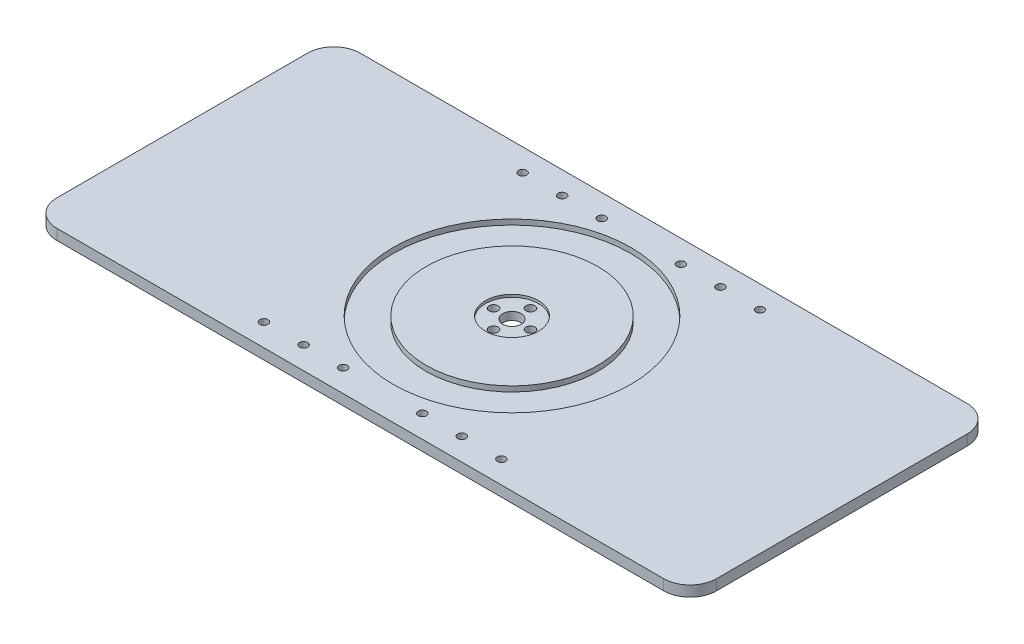
ISO-10303-21;
HEADER;
FILE_DESCRIPTION(('STEP AP214'),'2;1');
FILE_NAME('part.step','',(''),(''),'','','');
FILE_SCHEMA(('AUTOMOTIVE_DESIGN { 1 0 10303 214 1 1 1 1 }'));
ENDSEC;
DATA;
#1=APPLICATION_CONTEXT('core data for automotive mechanical design processes');
#2=APPLICATION_PROTOCOL_DEFINITION('international standard','automotive_design',2000,#1);
#3=PRODUCT_CONTEXT('',#1,'mechanical');
#4=PRODUCT('Part','Part','',(#3));
#5=PRODUCT_RELATED_PRODUCT_CATEGORY('part','',(#4));
#6=PRODUCT_DEFINITION_FORMATION('','',#4);
#7=PRODUCT_DEFINITION_CONTEXT('part definition',#1,'design');
#8=PRODUCT_DEFINITION('design','',#6,#7);
#9=PRODUCT_DEFINITION_SHAPE('','',#8);
#10=(LENGTH_UNIT() NAMED_UNIT(*) SI_UNIT(.MILLI.,.METRE.));
#11=(NAMED_UNIT(*) PLANE_ANGLE_UNIT() SI_UNIT($,.RADIAN.));
#12=(NAMED_UNIT(*) SI_UNIT($,.STERADIAN.) SOLID_ANGLE_UNIT());
#13=UNCERTAINTY_MEASURE_WITH_UNIT(LENGTH_MEASURE(1.E-05),#10,'distance_accuracy_value','');
#14=(GEOMETRIC_REPRESENTATION_CONTEXT(3) GLOBAL_UNCERTAINTY_ASSIGNED_CONTEXT((#13)) GLOBAL_UNIT_ASSIGNED_CONTEXT((#10,
#11,#12)) REPRESENTATION_CONTEXT('',''));
#15=CARTESIAN_POINT('',(0.,0.,0.));
#16=DIRECTION('',(0.,0.,1.));
#17=DIRECTION('',(1.,0.,0.));
#18=AXIS2_PLACEMENT_3D('',#15,#16,#17);
#19=CARTESIAN_POINT('',(0.,4.,0.));
#20=DIRECTION('',(0.,-1.,0.));
#21=DIRECTION('',(0.,0.,-1.));
#22=AXIS2_PLACEMENT_3D('',#19,#20,#21);
#23=CYLINDRICAL_SURFACE('',#22,3.5);
#24=CARTESIAN_POINT('',(0.,0.,0.));
#25=DIRECTION('',(0.,1.,0.));
#26=DIRECTION('',(0.,0.,1.));
#27=AXIS2_PLACEMENT_3D('',#24,#25,#26);
#28=CIRCLE('',#27,3.5);
#29=CARTESIAN_POINT('',(0.,0.,3.5));
#30=VERTEX_POINT('',#29);
#31=EDGE_CURVE('E133',#30,#30,#28,.T.);
#32=ORIENTED_EDGE('',*,*,#31,.F.);
#33=EDGE_LOOP('',(#32));
#34=FACE_BOUND('',#33,.T.);
#35=CARTESIAN_POINT('',(0.,3.,0.));
#36=DIRECTION('',(0.,1.,0.));
#37=DIRECTION('',(0.,0.,1.));
#38=AXIS2_PLACEMENT_3D('',#35,#36,#37);
#39=CIRCLE('',#38,3.5);
#40=CARTESIAN_POINT('',(0.,3.,3.5));
#41=VERTEX_POINT('',#40);
#42=EDGE_CURVE('E148',#41,#41,#39,.T.);
#43=ORIENTED_EDGE('',*,*,#42,.T.);
#44=EDGE_LOOP('',(#43));
#45=FACE_BOUND('',#44,.T.);
#46=ADVANCED_FACE('F39',(#34,#45),#23,.F.);
#47=CARTESIAN_POINT('',(0.,4.,0.));
#48=DIRECTION('',(0.,-1.,0.));
#49=DIRECTION('',(0.,0.,-1.));
#50=AXIS2_PLACEMENT_3D('',#47,#48,#49);
#51=PLANE('',#50);
#52=CARTESIAN_POINT('',(0.,4.,0.));
#53=DIRECTION('',(0.,1.,0.));
#54=DIRECTION('',(0.,0.,1.));
#55=AXIS2_PLACEMENT_3D('',#52,#53,#54);
#56=CIRCLE('',#55,10.05);
#57=CARTESIAN_POINT('',(0.,4.,10.05));
#58=VERTEX_POINT('',#57);
#59=EDGE_CURVE('E273',#58,#58,#56,.T.);
#60=ORIENTED_EDGE('',*,*,#59,.F.);
#61=EDGE_LOOP('',(#60));
#62=FACE_BOUND('',#61,.T.);
#63=CARTESIAN_POINT('',(0.,4.,0.));
#64=DIRECTION('',(0.,1.,0.));
#65=DIRECTION('',(0.,0.,1.));
#66=AXIS2_PLACEMENT_3D('',#63,#64,#65);
#67=CIRCLE('',#66,32.5);
#68=CARTESIAN_POINT('',(0.,4.,32.5));
#69=VERTEX_POINT('',#68);
#70=EDGE_CURVE('E151',#69,#69,#67,.T.);
#71=ORIENTED_EDGE('',*,*,#70,.T.);
#72=EDGE_LOOP('',(#71));
#73=FACE_BOUND('',#72,.T.);
#74=ADVANCED_FACE('F323',(#62,#73),#51,.F.);
#75=CARTESIAN_POINT('',(0.,4.,0.));
#76=DIRECTION('',(0.,1.,0.));
#77=DIRECTION('',(0.,0.,1.));
#78=AXIS2_PLACEMENT_3D('',#75,#76,#77);
#79=CIRCLE('',#78,45.);
#80=CARTESIAN_POINT('',(0.,4.,45.));
#81=VERTEX_POINT('',#80);
#82=EDGE_CURVE('E263',#81,#81,#79,.T.);
#83=ORIENTED_EDGE('',*,*,#82,.F.);
#84=EDGE_LOOP('',(#83));
#85=FACE_BOUND('',#84,.T.);
#86=DIRECTION('',(1.,0.,0.));
#87=VECTOR('',#86,1.);
#88=CARTESIAN_POINT('',(-125.,4.,57.5));
#89=LINE('',#88,#87);
#90=CARTESIAN_POINT('',(-115.,4.,57.5));
#91=VERTEX_POINT('',#90);
#92=CARTESIAN_POINT('',(115.,4.,57.5));
#93=VERTEX_POINT('',#92);
#94=EDGE_CURVE('E142',#91,#93,#89,.T.);
#95=ORIENTED_EDGE('',*,*,#94,.T.);
#96=CARTESIAN_POINT('',(115.,4.,47.5));
#97=DIRECTION('',(0.,-1.,0.));
#98=DIRECTION('',(0.,0.,-1.));
#99=AXIS2_PLACEMENT_3D('',#96,#97,#98);
#100=CIRCLE('',#99,10.);
#101=CARTESIAN_POINT('',(125.,4.,47.5));
#102=VERTEX_POINT('',#101);
#103=EDGE_CURVE('E166',#93,#102,#100,.F.);
#104=ORIENTED_EDGE('',*,*,#103,.T.);
#105=DIRECTION('',(0.,0.,-1.));
#106=VECTOR('',#105,1.);
#107=CARTESIAN_POINT('',(125.,4.,57.5));
#108=LINE('',#107,#106);
#109=CARTESIAN_POINT('',(125.,4.,-47.5));
#110=VERTEX_POINT('',#109);
#111=EDGE_CURVE('E125',#102,#110,#108,.T.);
#112=ORIENTED_EDGE('',*,*,#111,.T.);
#113=CARTESIAN_POINT('',(115.,4.,-47.5));
#114=DIRECTION('',(0.,-1.,0.));
#115=DIRECTION('',(0.,0.,-1.));
#116=AXIS2_PLACEMENT_3D('',#113,#114,#115);
#117=CIRCLE('',#116,10.);
#118=CARTESIAN_POINT('',(115.,4.,-57.5));
#119=VERTEX_POINT('',#118);
#120=EDGE_CURVE('E164',#110,#119,#117,.F.);
#121=ORIENTED_EDGE('',*,*,#120,.T.);
#122=DIRECTION('',(-1.,0.,0.));
#123=VECTOR('',#122,1.);
#124=CARTESIAN_POINT('',(-125.,4.,-57.5));
#125=LINE('',#124,#123);
#126=CARTESIAN_POINT('',(-115.,4.,-57.5));
#127=VERTEX_POINT('',#126);
#128=EDGE_CURVE('E177',#119,#127,#125,.T.);
#129=ORIENTED_EDGE('',*,*,#128,.T.);
#130=CARTESIAN_POINT('',(-115.,4.,-47.5));
#131=DIRECTION('',(0.,-1.,0.));
#132=DIRECTION('',(0.,0.,-1.));
#133=AXIS2_PLACEMENT_3D('',#130,#131,#132);
#134=CIRCLE('',#133,10.);
#135=CARTESIAN_POINT('',(-125.,4.,-47.5));
#136=VERTEX_POINT('',#135);
#137=EDGE_CURVE('E60',#127,#136,#134,.F.);
#138=ORIENTED_EDGE('',*,*,#137,.T.);
#139=DIRECTION('',(0.,0.,1.));
#140=VECTOR('',#139,1.);
#141=CARTESIAN_POINT('',(-125.,4.,57.5));
#142=LINE('',#141,#140);
#143=CARTESIAN_POINT('',(-125.,4.,47.5));
#144=VERTEX_POINT('',#143);
#145=EDGE_CURVE('E185',#136,#144,#142,.T.);
#146=ORIENTED_EDGE('',*,*,#145,.T.);
#147=CARTESIAN_POINT('',(-115.,4.,47.5));
#148=DIRECTION('',(0.,-1.,0.));
#149=DIRECTION('',(0.,0.,-1.));
#150=AXIS2_PLACEMENT_3D('',#147,#148,#149);
#151=CIRCLE('',#150,10.);
#152=EDGE_CURVE('E161',#144,#91,#151,.F.);
#153=ORIENTED_EDGE('',*,*,#152,.T.);
#154=EDGE_LOOP('',(#95,#104,#112,#121,#129,#138,#146,#153));
#155=FACE_BOUND('',#154,.T.);
#156=CARTESIAN_POINT('',(45.,4.,-49.));
#157=DIRECTION('',(0.,1.,0.));
#158=DIRECTION('',(0.,0.,1.));
#159=AXIS2_PLACEMENT_3D('',#156,#157,#158);
#160=CIRCLE('',#159,1.55);
#161=CARTESIAN_POINT('',(45.,4.,-47.45));
#162=VERTEX_POINT('',#161);
#163=EDGE_CURVE('E139',#162,#162,#160,.T.);
#164=ORIENTED_EDGE('',*,*,#163,.F.);
#165=EDGE_LOOP('',(#164));
#166=FACE_BOUND('',#165,.T.);
#167=CARTESIAN_POINT('',(45.,4.,49.));
#168=DIRECTION('',(0.,1.,0.));
#169=DIRECTION('',(0.,0.,-1.));
#170=AXIS2_PLACEMENT_3D('',#167,#168,#169);
#171=CIRCLE('',#170,1.55);
#172=CARTESIAN_POINT('',(45.,4.,47.45));
#173=VERTEX_POINT('',#172);
#174=EDGE_CURVE('E194',#173,#173,#171,.T.);
#175=ORIENTED_EDGE('',*,*,#174,.F.);
#176=EDGE_LOOP('',(#175));
#177=FACE_BOUND('',#176,.T.);
#178=CARTESIAN_POINT('',(-45.,4.,49.));
#179=DIRECTION('',(0.,1.,0.));
#180=DIRECTION('',(0.,0.,1.));
#181=AXIS2_PLACEMENT_3D('',#178,#179,#180);
#182=CIRCLE('',#181,1.55);
#183=CARTESIAN_POINT('',(-45.,4.,50.55));
#184=VERTEX_POINT('',#183);
#185=EDGE_CURVE('E200',#184,#184,#182,.T.);
#186=ORIENTED_EDGE('',*,*,#185,.F.);
#187=EDGE_LOOP('',(#186));
#188=FACE_BOUND('',#187,.T.);
#189=CARTESIAN_POINT('',(-45.,4.,-49.));
#190=DIRECTION('',(0.,1.,0.));
#191=DIRECTION('',(0.,0.,-1.));
#192=AXIS2_PLACEMENT_3D('',#189,#190,#191);
#193=CIRCLE('',#192,1.55);
#194=CARTESIAN_POINT('',(-45.,4.,-50.55));
#195=VERTEX_POINT('',#194);
#196=EDGE_CURVE('E206',#195,#195,#193,.T.);
#197=ORIENTED_EDGE('',*,*,#196,.F.);
#198=EDGE_LOOP('',(#197));
#199=FACE_BOUND('',#198,.T.);
#200=CARTESIAN_POINT('',(-15.,4.,49.));
#201=DIRECTION('',(0.,1.,0.));
#202=DIRECTION('',(0.,0.,1.));
#203=AXIS2_PLACEMENT_3D('',#200,#201,#202);
#204=CIRCLE('',#203,1.55);
#205=CARTESIAN_POINT('',(-15.,4.,50.55));
#206=VERTEX_POINT('',#205);
#207=EDGE_CURVE('E212',#206,#206,#204,.T.);
#208=ORIENTED_EDGE('',*,*,#207,.F.);
#209=EDGE_LOOP('',(#208));
#210=FACE_BOUND('',#209,.T.);
#211=CARTESIAN_POINT('',(15.,4.,49.));
#212=DIRECTION('',(0.,1.,0.));
#213=DIRECTION('',(0.,0.,-1.));
#214=AXIS2_PLACEMENT_3D('',#211,#212,#213);
#215=CIRCLE('',#214,1.55);
#216=CARTESIAN_POINT('',(15.,4.,47.45));
#217=VERTEX_POINT('',#216);
#218=EDGE_CURVE('E218',#217,#217,#215,.T.);
#219=ORIENTED_EDGE('',*,*,#218,.F.);
#220=EDGE_LOOP('',(#219));
#221=FACE_BOUND('',#220,.T.);
#222=CARTESIAN_POINT('',(15.,4.,-49.));
#223=DIRECTION('',(0.,1.,0.));
#224=DIRECTION('',(0.,0.,1.));
#225=AXIS2_PLACEMENT_3D('',#222,#223,#224);
#226=CIRCLE('',#225,1.55);
#227=CARTESIAN_POINT('',(15.,4.,-47.45));
#228=VERTEX_POINT('',#227);
#229=EDGE_CURVE('E224',#228,#228,#226,.T.);
#230=ORIENTED_EDGE('',*,*,#229,.F.);
#231=EDGE_LOOP('',(#230));
#232=FACE_BOUND('',#231,.T.);
#233=CARTESIAN_POINT('',(-15.,4.,-49.));
#234=DIRECTION('',(0.,1.,0.));
#235=DIRECTION('',(0.,0.,-1.));
#236=AXIS2_PLACEMENT_3D('',#233,#234,#235);
#237=CIRCLE('',#236,1.55);
#238=CARTESIAN_POINT('',(-15.,4.,-50.55));
#239=VERTEX_POINT('',#238);
#240=EDGE_CURVE('E230',#239,#239,#237,.T.);
#241=ORIENTED_EDGE('',*,*,#240,.F.);
#242=EDGE_LOOP('',(#241));
#243=FACE_BOUND('',#242,.T.);
#244=CARTESIAN_POINT('',(30.0000000000001,4.,-49.000000000001));
#245=DIRECTION('',(0.,1.,0.));
#246=DIRECTION('',(0.,0.,1.));
#247=AXIS2_PLACEMENT_3D('',#244,#245,#246);
#248=CIRCLE('',#247,1.55);
#249=CARTESIAN_POINT('',(30.0000000000001,4.,-47.450000000001));
#250=VERTEX_POINT('',#249);
#251=EDGE_CURVE('E236',#250,#250,#248,.T.);
#252=ORIENTED_EDGE('',*,*,#251,.F.);
#253=EDGE_LOOP('',(#252));
#254=FACE_BOUND('',#253,.T.);
#255=CARTESIAN_POINT('',(-29.9999999999999,4.,-49.000000000001));
#256=DIRECTION('',(0.,1.,0.));
#257=DIRECTION('',(0.,0.,1.));
#258=AXIS2_PLACEMENT_3D('',#255,#256,#257);
#259=CIRCLE('',#258,1.55);
#260=CARTESIAN_POINT('',(-29.9999999999999,4.,-47.450000000001));
#261=VERTEX_POINT('',#260);
#262=EDGE_CURVE('E242',#261,#261,#259,.T.);
#263=ORIENTED_EDGE('',*,*,#262,.F.);
#264=EDGE_LOOP('',(#263));
#265=FACE_BOUND('',#264,.T.);
#266=CARTESIAN_POINT('',(-30.,4.,48.999999999999));
#267=DIRECTION('',(0.,1.,0.));
#268=DIRECTION('',(0.,0.,1.));
#269=AXIS2_PLACEMENT_3D('',#266,#267,#268);
#270=CIRCLE('',#269,1.55000000000001);
#271=CARTESIAN_POINT('',(-30.,4.,50.549999999999));
#272=VERTEX_POINT('',#271);
#273=EDGE_CURVE('E248',#272,#272,#270,.T.);
#274=ORIENTED_EDGE('',*,*,#273,.F.);
#275=EDGE_LOOP('',(#274));
#276=FACE_BOUND('',#275,.T.);
#277=CARTESIAN_POINT('',(30.,4.,48.9999999999991));
#278=DIRECTION('',(0.,1.,0.));
#279=DIRECTION('',(0.,0.,1.));
#280=AXIS2_PLACEMENT_3D('',#277,#278,#279);
#281=CIRCLE('',#280,1.55);
#282=CARTESIAN_POINT('',(30.,4.,50.5499999999991));
#283=VERTEX_POINT('',#282);
#284=EDGE_CURVE('E254',#283,#283,#281,.T.);
#285=ORIENTED_EDGE('',*,*,#284,.F.);
#286=EDGE_LOOP('',(#285));
#287=FACE_BOUND('',#286,.T.);
#288=ADVANCED_FACE('F329',(#85,#155,#166,#177,#188,#199,#210,#221,#232,#243,#254,#265,#276,
#287),#51,.F.);
#289=CARTESIAN_POINT('',(0.,0.,0.));
#290=DIRECTION('',(0.,-1.,0.));
#291=DIRECTION('',(0.,0.,-1.));
#292=AXIS2_PLACEMENT_3D('',#289,#290,#291);
#293=PLANE('',#292);
#294=CARTESIAN_POINT('',(7.0000000000002,0.,-1.97666086873723E-13));
#295=DIRECTION('',(0.,-1.,0.));
#296=DIRECTION('',(0.,0.,-1.));
#297=AXIS2_PLACEMENT_3D('',#294,#295,#296);
#298=CIRCLE('',#297,1.70000000000015);
#299=CARTESIAN_POINT('',(7.0000000000002,0.,-1.70000000000035));
#300=VERTEX_POINT('',#299);
#301=EDGE_CURVE('E290',#300,#300,#298,.F.);
#302=ORIENTED_EDGE('',*,*,#301,.T.);
#303=EDGE_LOOP('',(#302));
#304=FACE_BOUND('',#303,.T.);
#305=CARTESIAN_POINT('',(0.,0.,-7.));
#306=DIRECTION('',(0.,-1.,0.));
#307=DIRECTION('',(0.,0.,-1.));
#308=AXIS2_PLACEMENT_3D('',#305,#306,#307);
#309=CIRCLE('',#308,1.7);
#310=CARTESIAN_POINT('',(0.,0.,-8.7));
#311=VERTEX_POINT('',#310);
#312=EDGE_CURVE('E296',#311,#311,#309,.F.);
#313=ORIENTED_EDGE('',*,*,#312,.T.);
#314=EDGE_LOOP('',(#313));
#315=FACE_BOUND('',#314,.T.);
#316=CARTESIAN_POINT('',(3.95332173747447E-13,0.,7.));
#317=DIRECTION('',(0.,-1.,0.));
#318=DIRECTION('',(0.,0.,-1.));
#319=AXIS2_PLACEMENT_3D('',#316,#317,#318);
#320=CIRCLE('',#319,1.70000000000042);
#321=CARTESIAN_POINT('',(3.95332173747447E-13,0.,5.29999999999958));
#322=VERTEX_POINT('',#321);
#323=EDGE_CURVE('E284',#322,#322,#320,.F.);
#324=ORIENTED_EDGE('',*,*,#323,.T.);
#325=EDGE_LOOP('',(#324));
#326=FACE_BOUND('',#325,.T.);
#327=CARTESIAN_POINT('',(-6.9999999999998,0.,1.98523339633126E-13));
#328=DIRECTION('',(0.,-1.,0.));
#329=DIRECTION('',(0.,0.,-1.));
#330=AXIS2_PLACEMENT_3D('',#327,#328,#329);
#331=CIRCLE('',#330,1.70000000000032);
#332=CARTESIAN_POINT('',(-6.9999999999998,0.,-1.70000000000012));
#333=VERTEX_POINT('',#332);
#334=EDGE_CURVE('E276',#333,#333,#331,.F.);
#335=ORIENTED_EDGE('',*,*,#334,.T.);
#336=EDGE_LOOP('',(#335));
#337=FACE_BOUND('',#336,.T.);
#338=CARTESIAN_POINT('',(-30.,0.,48.999999999999));
#339=DIRECTION('',(0.,1.,0.));
#340=DIRECTION('',(0.,0.,1.));
#341=AXIS2_PLACEMENT_3D('',#338,#339,#340);
#342=CIRCLE('',#341,1.55000000000001);
#343=CARTESIAN_POINT('',(-30.,0.,50.549999999999));
#344=VERTEX_POINT('',#343);
#345=EDGE_CURVE('E251',#344,#344,#342,.T.);
#346=ORIENTED_EDGE('',*,*,#345,.T.);
#347=EDGE_LOOP('',(#346));
#348=FACE_BOUND('',#347,.T.);
#349=CARTESIAN_POINT('',(30.0000000000001,0.,-49.000000000001));
#350=DIRECTION('',(0.,1.,0.));
#351=DIRECTION('',(0.,0.,1.));
#352=AXIS2_PLACEMENT_3D('',#349,#350,#351);
#353=CIRCLE('',#352,1.55);
#354=CARTESIAN_POINT('',(30.0000000000001,0.,-47.450000000001));
#355=VERTEX_POINT('',#354);
#356=EDGE_CURVE('E239',#355,#355,#353,.T.);
#357=ORIENTED_EDGE('',*,*,#356,.T.);
#358=EDGE_LOOP('',(#357));
#359=FACE_BOUND('',#358,.T.);
#360=CARTESIAN_POINT('',(15.,0.,-49.));
#361=DIRECTION('',(0.,1.,0.));
#362=DIRECTION('',(0.,0.,1.));
#363=AXIS2_PLACEMENT_3D('',#360,#361,#362);
#364=CIRCLE('',#363,1.55);
#365=CARTESIAN_POINT('',(15.,0.,-47.45));
#366=VERTEX_POINT('',#365);
#367=EDGE_CURVE('E227',#366,#366,#364,.T.);
#368=ORIENTED_EDGE('',*,*,#367,.T.);
#369=EDGE_LOOP('',(#368));
#370=FACE_BOUND('',#369,.T.);
#371=CARTESIAN_POINT('',(-15.,0.,49.));
#372=DIRECTION('',(0.,1.,0.));
#373=DIRECTION('',(0.,0.,1.));
#374=AXIS2_PLACEMENT_3D('',#371,#372,#373);
#375=CIRCLE('',#374,1.55);
#376=CARTESIAN_POINT('',(-15.,0.,50.55));
#377=VERTEX_POINT('',#376);
#378=EDGE_CURVE('E215',#377,#377,#375,.T.);
#379=ORIENTED_EDGE('',*,*,#378,.T.);
#380=EDGE_LOOP('',(#379));
#381=FACE_BOUND('',#380,.T.);
#382=CARTESIAN_POINT('',(-45.,0.,49.));
#383=DIRECTION('',(0.,1.,0.));
#384=DIRECTION('',(0.,0.,1.));
#385=AXIS2_PLACEMENT_3D('',#382,#383,#384);
#386=CIRCLE('',#385,1.55);
#387=CARTESIAN_POINT('',(-45.,0.,50.55));
#388=VERTEX_POINT('',#387);
#389=EDGE_CURVE('E203',#388,#388,#386,.T.);
#390=ORIENTED_EDGE('',*,*,#389,.T.);
#391=EDGE_LOOP('',(#390));
#392=FACE_BOUND('',#391,.T.);
#393=CARTESIAN_POINT('',(45.,0.,-49.));
#394=DIRECTION('',(0.,1.,0.));
#395=DIRECTION('',(0.,0.,1.));
#396=AXIS2_PLACEMENT_3D('',#393,#394,#395);
#397=CIRCLE('',#396,1.55);
#398=CARTESIAN_POINT('',(45.,0.,-47.45));
#399=VERTEX_POINT('',#398);
#400=EDGE_CURVE('E191',#399,#399,#397,.T.);
#401=ORIENTED_EDGE('',*,*,#400,.T.);
#402=EDGE_LOOP('',(#401));
#403=FACE_BOUND('',#402,.T.);
#404=DIRECTION('',(0.,0.,-1.));
#405=VECTOR('',#404,1.);
#406=CARTESIAN_POINT('',(125.,0.,57.5));
#407=LINE('',#406,#405);
#408=CARTESIAN_POINT('',(125.,0.,47.5));
#409=VERTEX_POINT('',#408);
#410=CARTESIAN_POINT('',(125.,0.,-47.5));
#411=VERTEX_POINT('',#410);
#412=EDGE_CURVE('E122',#409,#411,#407,.T.);
#413=ORIENTED_EDGE('',*,*,#412,.F.);
#414=CARTESIAN_POINT('',(115.,0.,47.5));
#415=DIRECTION('',(0.,-1.,0.));
#416=DIRECTION('',(0.,0.,-1.));
#417=AXIS2_PLACEMENT_3D('',#414,#415,#416);
#418=CIRCLE('',#417,10.);
#419=CARTESIAN_POINT('',(115.,0.,57.5));
#420=VERTEX_POINT('',#419);
#421=EDGE_CURVE('E105',#409,#420,#418,.T.);
#422=ORIENTED_EDGE('',*,*,#421,.T.);
#423=DIRECTION('',(1.,0.,0.));
#424=VECTOR('',#423,1.);
#425=CARTESIAN_POINT('',(-125.,0.,57.5));
#426=LINE('',#425,#424);
#427=CARTESIAN_POINT('',(-115.,0.,57.5));
#428=VERTEX_POINT('',#427);
#429=EDGE_CURVE('E146',#428,#420,#426,.T.);
#430=ORIENTED_EDGE('',*,*,#429,.F.);
#431=CARTESIAN_POINT('',(-115.,0.,47.5));
#432=DIRECTION('',(0.,-1.,0.));
#433=DIRECTION('',(0.,0.,-1.));
#434=AXIS2_PLACEMENT_3D('',#431,#432,#433);
#435=CIRCLE('',#434,10.);
#436=CARTESIAN_POINT('',(-125.,0.,47.5));
#437=VERTEX_POINT('',#436);
#438=EDGE_CURVE('E126',#428,#437,#435,.T.);
#439=ORIENTED_EDGE('',*,*,#438,.T.);
#440=DIRECTION('',(0.,0.,1.));
#441=VECTOR('',#440,1.);
#442=CARTESIAN_POINT('',(-125.,0.,57.5));
#443=LINE('',#442,#441);
#444=CARTESIAN_POINT('',(-125.,0.,-47.5));
#445=VERTEX_POINT('',#444);
#446=EDGE_CURVE('E136',#445,#437,#443,.T.);
#447=ORIENTED_EDGE('',*,*,#446,.F.);
#448=CARTESIAN_POINT('',(-115.,0.,-47.5));
#449=DIRECTION('',(0.,-1.,0.));
#450=DIRECTION('',(0.,0.,-1.));
#451=AXIS2_PLACEMENT_3D('',#448,#449,#450);
#452=CIRCLE('',#451,10.);
#453=CARTESIAN_POINT('',(-115.,0.,-57.5));
#454=VERTEX_POINT('',#453);
#455=EDGE_CURVE('E155',#445,#454,#452,.T.);
#456=ORIENTED_EDGE('',*,*,#455,.T.);
#457=DIRECTION('',(-1.,0.,0.));
#458=VECTOR('',#457,1.);
#459=CARTESIAN_POINT('',(-125.,0.,-57.5));
#460=LINE('',#459,#458);
#461=CARTESIAN_POINT('',(115.,0.,-57.5));
#462=VERTEX_POINT('',#461);
#463=EDGE_CURVE('E132',#462,#454,#460,.T.);
#464=ORIENTED_EDGE('',*,*,#463,.F.);
#465=CARTESIAN_POINT('',(115.,0.,-47.5));
#466=DIRECTION('',(0.,-1.,0.));
#467=DIRECTION('',(0.,0.,-1.));
#468=AXIS2_PLACEMENT_3D('',#465,#466,#467);
#469=CIRCLE('',#468,10.);
#470=EDGE_CURVE('E116',#462,#411,#469,.T.);
#471=ORIENTED_EDGE('',*,*,#470,.T.);
#472=EDGE_LOOP('',(#413,#422,#430,#439,#447,#456,#464,#471));
#473=FACE_BOUND('',#472,.T.);
#474=ORIENTED_EDGE('',*,*,#31,.T.);
#475=EDGE_LOOP('',(#474));
#476=FACE_BOUND('',#475,.T.);
#477=CARTESIAN_POINT('',(45.,0.,49.));
#478=DIRECTION('',(0.,1.,0.));
#479=DIRECTION('',(0.,0.,-1.));
#480=AXIS2_PLACEMENT_3D('',#477,#478,#479);
#481=CIRCLE('',#480,1.55);
#482=CARTESIAN_POINT('',(45.,0.,47.45));
#483=VERTEX_POINT('',#482);
#484=EDGE_CURVE('E197',#483,#483,#481,.T.);
#485=ORIENTED_EDGE('',*,*,#484,.T.);
#486=EDGE_LOOP('',(#485));
#487=FACE_BOUND('',#486,.T.);
#488=CARTESIAN_POINT('',(-45.,0.,-49.));
#489=DIRECTION('',(0.,1.,0.));
#490=DIRECTION('',(0.,0.,-1.));
#491=AXIS2_PLACEMENT_3D('',#488,#489,#490);
#492=CIRCLE('',#491,1.55);
#493=CARTESIAN_POINT('',(-45.,0.,-50.55));
#494=VERTEX_POINT('',#493);
#495=EDGE_CURVE('E209',#494,#494,#492,.T.);
#496=ORIENTED_EDGE('',*,*,#495,.T.);
#497=EDGE_LOOP('',(#496));
#498=FACE_BOUND('',#497,.T.);
#499=CARTESIAN_POINT('',(15.,0.,49.));
#500=DIRECTION('',(0.,1.,0.));
#501=DIRECTION('',(0.,0.,-1.));
#502=AXIS2_PLACEMENT_3D('',#499,#500,#501);
#503=CIRCLE('',#502,1.55);
#504=CARTESIAN_POINT('',(15.,0.,47.45));
#505=VERTEX_POINT('',#504);
#506=EDGE_CURVE('E221',#505,#505,#503,.T.);
#507=ORIENTED_EDGE('',*,*,#506,.T.);
#508=EDGE_LOOP('',(#507));
#509=FACE_BOUND('',#508,.T.);
#510=CARTESIAN_POINT('',(-15.,0.,-49.));
#511=DIRECTION('',(0.,1.,0.));
#512=DIRECTION('',(0.,0.,-1.));
#513=AXIS2_PLACEMENT_3D('',#510,#511,#512);
#514=CIRCLE('',#513,1.55);
#515=CARTESIAN_POINT('',(-15.,0.,-50.55));
#516=VERTEX_POINT('',#515);
#517=EDGE_CURVE('E233',#516,#516,#514,.T.);
#518=ORIENTED_EDGE('',*,*,#517,.T.);
#519=EDGE_LOOP('',(#518));
#520=FACE_BOUND('',#519,.T.);
#521=CARTESIAN_POINT('',(-29.9999999999999,0.,-49.000000000001));
#522=DIRECTION('',(0.,1.,0.));
#523=DIRECTION('',(0.,0.,1.));
#524=AXIS2_PLACEMENT_3D('',#521,#522,#523);
#525=CIRCLE('',#524,1.55);
#526=CARTESIAN_POINT('',(-29.9999999999999,0.,-47.450000000001));
#527=VERTEX_POINT('',#526);
#528=EDGE_CURVE('E245',#527,#527,#525,.T.);
#529=ORIENTED_EDGE('',*,*,#528,.T.);
#530=EDGE_LOOP('',(#529));
#531=FACE_BOUND('',#530,.T.);
#532=CARTESIAN_POINT('',(30.,0.,48.9999999999991));
#533=DIRECTION('',(0.,1.,0.));
#534=DIRECTION('',(0.,0.,1.));
#535=AXIS2_PLACEMENT_3D('',#532,#533,#534);
#536=CIRCLE('',#535,1.55);
#537=CARTESIAN_POINT('',(30.,0.,50.5499999999991));
#538=VERTEX_POINT('',#537);
#539=EDGE_CURVE('E257',#538,#538,#536,.T.);
#540=ORIENTED_EDGE('',*,*,#539,.T.);
#541=EDGE_LOOP('',(#540));
#542=FACE_BOUND('',#541,.T.);
#543=ADVANCED_FACE('F129',(#304,#315,#326,#337,#348,#359,#370,#381,#392,#403,#473,#476,#487,
#498,#509,#520,#531,#542),#293,.T.);
#544=CARTESIAN_POINT('',(125.,4.,57.5));
#545=DIRECTION('',(-1.,0.,0.));
#546=DIRECTION('',(0.,0.,1.));
#547=AXIS2_PLACEMENT_3D('',#544,#545,#546);
#548=PLANE('',#547);
#549=ORIENTED_EDGE('',*,*,#111,.F.);
#550=DIRECTION('',(0.,-1.,0.));
#551=VECTOR('',#550,1.);
#552=CARTESIAN_POINT('',(125.,4.,47.5));
#553=LINE('',#552,#551);
#554=EDGE_CURVE('E109',#102,#409,#553,.T.);
#555=ORIENTED_EDGE('',*,*,#554,.T.);
#556=ORIENTED_EDGE('',*,*,#412,.T.);
#557=DIRECTION('',(0.,-1.,0.));
#558=VECTOR('',#557,1.);
#559=CARTESIAN_POINT('',(125.,4.,-47.5));
#560=LINE('',#559,#558);
#561=EDGE_CURVE('E127',#411,#110,#560,.F.);
#562=ORIENTED_EDGE('',*,*,#561,.T.);
#563=EDGE_LOOP('',(#549,#555,#556,#562));
#564=FACE_BOUND('',#563,.T.);
#565=ADVANCED_FACE('F121',(#564),#548,.F.);
#566=CARTESIAN_POINT('',(-125.,4.,-57.5));
#567=DIRECTION('',(0.,0.,1.));
#568=DIRECTION('',(1.,0.,0.));
#569=AXIS2_PLACEMENT_3D('',#566,#567,#568);
#570=PLANE('',#569);
#571=ORIENTED_EDGE('',*,*,#128,.F.);
#572=DIRECTION('',(0.,-1.,0.));
#573=VECTOR('',#572,1.);
#574=CARTESIAN_POINT('',(115.,4.,-57.5));
#575=LINE('',#574,#573);
#576=EDGE_CURVE('E170',#119,#462,#575,.T.);
#577=ORIENTED_EDGE('',*,*,#576,.T.);
#578=ORIENTED_EDGE('',*,*,#463,.T.);
#579=DIRECTION('',(0.,-1.,0.));
#580=VECTOR('',#579,1.);
#581=CARTESIAN_POINT('',(-115.,4.,-57.5));
#582=LINE('',#581,#580);
#583=EDGE_CURVE('E168',#454,#127,#582,.F.);
#584=ORIENTED_EDGE('',*,*,#583,.T.);
#585=EDGE_LOOP('',(#571,#577,#578,#584));
#586=FACE_BOUND('',#585,.T.);
#587=ADVANCED_FACE('F175',(#586),#570,.F.);
#588=CARTESIAN_POINT('',(-125.,4.,57.5));
#589=DIRECTION('',(1.,0.,0.));
#590=DIRECTION('',(0.,0.,-1.));
#591=AXIS2_PLACEMENT_3D('',#588,#589,#590);
#592=PLANE('',#591);
#593=ORIENTED_EDGE('',*,*,#145,.F.);
#594=DIRECTION('',(0.,-1.,0.));
#595=VECTOR('',#594,1.);
#596=CARTESIAN_POINT('',(-125.,4.,-47.5));
#597=LINE('',#596,#595);
#598=EDGE_CURVE('E11',#136,#445,#597,.T.);
#599=ORIENTED_EDGE('',*,*,#598,.T.);
#600=ORIENTED_EDGE('',*,*,#446,.T.);
#601=DIRECTION('',(0.,-1.,0.));
#602=VECTOR('',#601,1.);
#603=CARTESIAN_POINT('',(-125.,4.,47.5));
#604=LINE('',#603,#602);
#605=EDGE_CURVE('E47',#437,#144,#604,.F.);
#606=ORIENTED_EDGE('',*,*,#605,.T.);
#607=EDGE_LOOP('',(#593,#599,#600,#606));
#608=FACE_BOUND('',#607,.T.);
#609=ADVANCED_FACE('F184',(#608),#592,.F.);
#610=CARTESIAN_POINT('',(-125.,4.,57.5));
#611=DIRECTION('',(0.,0.,-1.));
#612=DIRECTION('',(-1.,0.,0.));
#613=AXIS2_PLACEMENT_3D('',#610,#611,#612);
#614=PLANE('',#613);
#615=ORIENTED_EDGE('',*,*,#429,.T.);
#616=DIRECTION('',(0.,-1.,0.));
#617=VECTOR('',#616,1.);
#618=CARTESIAN_POINT('',(115.,4.,57.5));
#619=LINE('',#618,#617);
#620=EDGE_CURVE('E110',#420,#93,#619,.F.);
#621=ORIENTED_EDGE('',*,*,#620,.T.);
#622=ORIENTED_EDGE('',*,*,#94,.F.);
#623=DIRECTION('',(0.,-1.,0.));
#624=VECTOR('',#623,1.);
#625=CARTESIAN_POINT('',(-115.,4.,57.5));
#626=LINE('',#625,#624);
#627=EDGE_CURVE('E115',#91,#428,#626,.T.);
#628=ORIENTED_EDGE('',*,*,#627,.T.);
#629=EDGE_LOOP('',(#615,#621,#622,#628));
#630=FACE_BOUND('',#629,.T.);
#631=ADVANCED_FACE('F343',(#630),#614,.F.);
#632=CARTESIAN_POINT('',(45.,4.,-49.));
#633=DIRECTION('',(0.,-1.,0.));
#634=DIRECTION('',(0.,0.,-1.));
#635=AXIS2_PLACEMENT_3D('',#632,#633,#634);
#636=CYLINDRICAL_SURFACE('',#635,1.55);
#637=ORIENTED_EDGE('',*,*,#163,.T.);
#638=EDGE_LOOP('',(#637));
#639=FACE_BOUND('',#638,.T.);
#640=ORIENTED_EDGE('',*,*,#400,.F.);
#641=EDGE_LOOP('',(#640));
#642=FACE_BOUND('',#641,.T.);
#643=ADVANCED_FACE('F335',(#639,#642),#636,.F.);
#644=CARTESIAN_POINT('',(45.,4.,49.));
#645=DIRECTION('',(0.,-1.,0.));
#646=DIRECTION('',(0.,0.,-1.));
#647=AXIS2_PLACEMENT_3D('',#644,#645,#646);
#648=CYLINDRICAL_SURFACE('',#647,1.55);
#649=ORIENTED_EDGE('',*,*,#174,.T.);
#650=EDGE_LOOP('',(#649));
#651=FACE_BOUND('',#650,.T.);
#652=ORIENTED_EDGE('',*,*,#484,.F.);
#653=EDGE_LOOP('',(#652));
#654=FACE_BOUND('',#653,.T.);
#655=ADVANCED_FACE('F440',(#651,#654),#648,.F.);
#656=CARTESIAN_POINT('',(-45.,4.,49.));
#657=DIRECTION('',(0.,-1.,0.));
#658=DIRECTION('',(0.,0.,-1.));
#659=AXIS2_PLACEMENT_3D('',#656,#657,#658);
#660=CYLINDRICAL_SURFACE('',#659,1.55);
#661=ORIENTED_EDGE('',*,*,#185,.T.);
#662=EDGE_LOOP('',(#661));
#663=FACE_BOUND('',#662,.T.);
#664=ORIENTED_EDGE('',*,*,#389,.F.);
#665=EDGE_LOOP('',(#664));
#666=FACE_BOUND('',#665,.T.);
#667=ADVANCED_FACE('F437',(#663,#666),#660,.F.);
#668=CARTESIAN_POINT('',(-45.,4.,-49.));
#669=DIRECTION('',(0.,-1.,0.));
#670=DIRECTION('',(0.,0.,-1.));
#671=AXIS2_PLACEMENT_3D('',#668,#669,#670);
#672=CYLINDRICAL_SURFACE('',#671,1.55);
#673=ORIENTED_EDGE('',*,*,#196,.T.);
#674=EDGE_LOOP('',(#673));
#675=FACE_BOUND('',#674,.T.);
#676=ORIENTED_EDGE('',*,*,#495,.F.);
#677=EDGE_LOOP('',(#676));
#678=FACE_BOUND('',#677,.T.);
#679=ADVANCED_FACE('F433',(#675,#678),#672,.F.);
#680=CARTESIAN_POINT('',(-15.,4.,49.));
#681=DIRECTION('',(0.,-1.,0.));
#682=DIRECTION('',(0.,0.,-1.));
#683=AXIS2_PLACEMENT_3D('',#680,#681,#682);
#684=CYLINDRICAL_SURFACE('',#683,1.55);
#685=ORIENTED_EDGE('',*,*,#207,.T.);
#686=EDGE_LOOP('',(#685));
#687=FACE_BOUND('',#686,.T.);
#688=ORIENTED_EDGE('',*,*,#378,.F.);
#689=EDGE_LOOP('',(#688));
#690=FACE_BOUND('',#689,.T.);
#691=ADVANCED_FACE('F429',(#687,#690),#684,.F.);
#692=CARTESIAN_POINT('',(15.,4.,49.));
#693=DIRECTION('',(0.,-1.,0.));
#694=DIRECTION('',(0.,0.,-1.));
#695=AXIS2_PLACEMENT_3D('',#692,#693,#694);
#696=CYLINDRICAL_SURFACE('',#695,1.55);
#697=ORIENTED_EDGE('',*,*,#218,.T.);
#698=EDGE_LOOP('',(#697));
#699=FACE_BOUND('',#698,.T.);
#700=ORIENTED_EDGE('',*,*,#506,.F.);
#701=EDGE_LOOP('',(#700));
#702=FACE_BOUND('',#701,.T.);
#703=ADVANCED_FACE('F425',(#699,#702),#696,.F.);
#704=CARTESIAN_POINT('',(15.,4.,-49.));
#705=DIRECTION('',(0.,-1.,0.));
#706=DIRECTION('',(0.,0.,-1.));
#707=AXIS2_PLACEMENT_3D('',#704,#705,#706);
#708=CYLINDRICAL_SURFACE('',#707,1.55);
#709=ORIENTED_EDGE('',*,*,#229,.T.);
#710=EDGE_LOOP('',(#709));
#711=FACE_BOUND('',#710,.T.);
#712=ORIENTED_EDGE('',*,*,#367,.F.);
#713=EDGE_LOOP('',(#712));
#714=FACE_BOUND('',#713,.T.);
#715=ADVANCED_FACE('F421',(#711,#714),#708,.F.);
#716=CARTESIAN_POINT('',(-15.,4.,-49.));
#717=DIRECTION('',(0.,-1.,0.));
#718=DIRECTION('',(0.,0.,-1.));
#719=AXIS2_PLACEMENT_3D('',#716,#717,#718);
#720=CYLINDRICAL_SURFACE('',#719,1.55);
#721=ORIENTED_EDGE('',*,*,#240,.T.);
#722=EDGE_LOOP('',(#721));
#723=FACE_BOUND('',#722,.T.);
#724=ORIENTED_EDGE('',*,*,#517,.F.);
#725=EDGE_LOOP('',(#724));
#726=FACE_BOUND('',#725,.T.);
#727=ADVANCED_FACE('F417',(#723,#726),#720,.F.);
#728=CARTESIAN_POINT('',(30.0000000000001,4.,-49.000000000001));
#729=DIRECTION('',(0.,-1.,0.));
#730=DIRECTION('',(0.,0.,-1.));
#731=AXIS2_PLACEMENT_3D('',#728,#729,#730);
#732=CYLINDRICAL_SURFACE('',#731,1.55);
#733=ORIENTED_EDGE('',*,*,#251,.T.);
#734=EDGE_LOOP('',(#733));
#735=FACE_BOUND('',#734,.T.);
#736=ORIENTED_EDGE('',*,*,#356,.F.);
#737=EDGE_LOOP('',(#736));
#738=FACE_BOUND('',#737,.T.);
#739=ADVANCED_FACE('F413',(#735,#738),#732,.F.);
#740=CARTESIAN_POINT('',(-29.9999999999999,4.,-49.000000000001));
#741=DIRECTION('',(0.,-1.,0.));
#742=DIRECTION('',(0.,0.,-1.));
#743=AXIS2_PLACEMENT_3D('',#740,#741,#742);
#744=CYLINDRICAL_SURFACE('',#743,1.55);
#745=ORIENTED_EDGE('',*,*,#262,.T.);
#746=EDGE_LOOP('',(#745));
#747=FACE_BOUND('',#746,.T.);
#748=ORIENTED_EDGE('',*,*,#528,.F.);
#749=EDGE_LOOP('',(#748));
#750=FACE_BOUND('',#749,.T.);
#751=ADVANCED_FACE('F406',(#747,#750),#744,.F.);
#752=CARTESIAN_POINT('',(-30.,4.,48.999999999999));
#753=DIRECTION('',(0.,-1.,0.));
#754=DIRECTION('',(0.,0.,-1.));
#755=AXIS2_PLACEMENT_3D('',#752,#753,#754);
#756=CYLINDRICAL_SURFACE('',#755,1.55000000000001);
#757=ORIENTED_EDGE('',*,*,#273,.T.);
#758=EDGE_LOOP('',(#757));
#759=FACE_BOUND('',#758,.T.);
#760=ORIENTED_EDGE('',*,*,#345,.F.);
#761=EDGE_LOOP('',(#760));
#762=FACE_BOUND('',#761,.T.);
#763=ADVANCED_FACE('F395',(#759,#762),#756,.F.);
#764=CARTESIAN_POINT('',(30.,4.,48.9999999999991));
#765=DIRECTION('',(0.,-1.,0.));
#766=DIRECTION('',(0.,0.,-1.));
#767=AXIS2_PLACEMENT_3D('',#764,#765,#766);
#768=CYLINDRICAL_SURFACE('',#767,1.55);
#769=ORIENTED_EDGE('',*,*,#284,.T.);
#770=EDGE_LOOP('',(#769));
#771=FACE_BOUND('',#770,.T.);
#772=ORIENTED_EDGE('',*,*,#539,.F.);
#773=EDGE_LOOP('',(#772));
#774=FACE_BOUND('',#773,.T.);
#775=ADVANCED_FACE('F391',(#771,#774),#768,.F.);
#776=CARTESIAN_POINT('',(0.,2.,0.));
#777=DIRECTION('',(0.,1.,0.));
#778=DIRECTION('',(0.,0.,1.));
#779=AXIS2_PLACEMENT_3D('',#776,#777,#778);
#780=CYLINDRICAL_SURFACE('',#779,45.);
#781=CARTESIAN_POINT('',(0.,2.,0.));
#782=DIRECTION('',(0.,1.,0.));
#783=DIRECTION('',(0.,0.,1.));
#784=AXIS2_PLACEMENT_3D('',#781,#782,#783);
#785=CIRCLE('',#784,45.);
#786=CARTESIAN_POINT('',(0.,2.,45.));
#787=VERTEX_POINT('',#786);
#788=EDGE_CURVE('E260',#787,#787,#785,.T.);
#789=ORIENTED_EDGE('',*,*,#788,.F.);
#790=EDGE_LOOP('',(#789));
#791=FACE_BOUND('',#790,.T.);
#792=ORIENTED_EDGE('',*,*,#82,.T.);
#793=EDGE_LOOP('',(#792));
#794=FACE_BOUND('',#793,.T.);
#795=ADVANCED_FACE('F394',(#791,#794),#780,.F.);
#796=CARTESIAN_POINT('',(0.,2.,0.));
#797=DIRECTION('',(0.,1.,0.));
#798=DIRECTION('',(0.,0.,1.));
#799=AXIS2_PLACEMENT_3D('',#796,#797,#798);
#800=PLANE('',#799);
#801=CARTESIAN_POINT('',(0.,2.,0.));
#802=DIRECTION('',(0.,1.,0.));
#803=DIRECTION('',(0.,0.,1.));
#804=AXIS2_PLACEMENT_3D('',#801,#802,#803);
#805=CIRCLE('',#804,32.5);
#806=CARTESIAN_POINT('',(0.,2.,32.5));
#807=VERTEX_POINT('',#806);
#808=EDGE_CURVE('E266',#807,#807,#805,.T.);
#809=ORIENTED_EDGE('',*,*,#808,.F.);
#810=EDGE_LOOP('',(#809));
#811=FACE_BOUND('',#810,.T.);
#812=ORIENTED_EDGE('',*,*,#788,.T.);
#813=EDGE_LOOP('',(#812));
#814=FACE_BOUND('',#813,.T.);
#815=ADVANCED_FACE('F403',(#811,#814),#800,.T.);
#816=CARTESIAN_POINT('',(0.,2.,0.));
#817=DIRECTION('',(0.,1.,0.));
#818=DIRECTION('',(0.,0.,1.));
#819=AXIS2_PLACEMENT_3D('',#816,#817,#818);
#820=CYLINDRICAL_SURFACE('',#819,32.5);
#821=ORIENTED_EDGE('',*,*,#808,.T.);
#822=EDGE_LOOP('',(#821));
#823=FACE_BOUND('',#822,.T.);
#824=ORIENTED_EDGE('',*,*,#70,.F.);
#825=EDGE_LOOP('',(#824));
#826=FACE_BOUND('',#825,.T.);
#827=ADVANCED_FACE('F531',(#823,#826),#820,.T.);
#828=CARTESIAN_POINT('',(0.,3.,0.));
#829=DIRECTION('',(0.,1.,0.));
#830=DIRECTION('',(0.,0.,1.));
#831=AXIS2_PLACEMENT_3D('',#828,#829,#830);
#832=CYLINDRICAL_SURFACE('',#831,10.05);
#833=CARTESIAN_POINT('',(0.,3.,0.));
#834=DIRECTION('',(0.,1.,0.));
#835=DIRECTION('',(0.,0.,1.));
#836=AXIS2_PLACEMENT_3D('',#833,#834,#835);
#837=CIRCLE('',#836,10.05);
#838=CARTESIAN_POINT('',(0.,3.,10.05));
#839=VERTEX_POINT('',#838);
#840=EDGE_CURVE('E152',#839,#839,#837,.T.);
#841=ORIENTED_EDGE('',*,*,#840,.F.);
#842=EDGE_LOOP('',(#841));
#843=FACE_BOUND('',#842,.T.);
#844=ORIENTED_EDGE('',*,*,#59,.T.);
#845=EDGE_LOOP('',(#844));
#846=FACE_BOUND('',#845,.T.);
#847=ADVANCED_FACE('F526',(#843,#846),#832,.F.);
#848=CARTESIAN_POINT('',(0.,3.,0.));
#849=DIRECTION('',(0.,1.,0.));
#850=DIRECTION('',(0.,0.,1.));
#851=AXIS2_PLACEMENT_3D('',#848,#849,#850);
#852=PLANE('',#851);
#853=ORIENTED_EDGE('',*,*,#42,.F.);
#854=EDGE_LOOP('',(#853));
#855=FACE_BOUND('',#854,.T.);
#856=CARTESIAN_POINT('',(-6.9999999999998,3.,1.98523339633126E-13));
#857=DIRECTION('',(0.,1.,0.));
#858=DIRECTION('',(0.,0.,1.));
#859=AXIS2_PLACEMENT_3D('',#856,#857,#858);
#860=CIRCLE('',#859,1.70000000000032);
#861=CARTESIAN_POINT('',(-6.9999999999998,3.,1.70000000000052));
#862=VERTEX_POINT('',#861);
#863=EDGE_CURVE('E281',#862,#862,#860,.F.);
#864=ORIENTED_EDGE('',*,*,#863,.T.);
#865=EDGE_LOOP('',(#864));
#866=FACE_BOUND('',#865,.T.);
#867=CARTESIAN_POINT('',(3.95332173747447E-13,3.,7.));
#868=DIRECTION('',(0.,1.,0.));
#869=DIRECTION('',(0.,0.,1.));
#870=AXIS2_PLACEMENT_3D('',#867,#868,#869);
#871=CIRCLE('',#870,1.70000000000042);
#872=CARTESIAN_POINT('',(3.95332173747447E-13,3.,8.70000000000042));
#873=VERTEX_POINT('',#872);
#874=EDGE_CURVE('E287',#873,#873,#871,.F.);
#875=ORIENTED_EDGE('',*,*,#874,.T.);
#876=EDGE_LOOP('',(#875));
#877=FACE_BOUND('',#876,.T.);
#878=CARTESIAN_POINT('',(7.0000000000002,3.,-1.97666086873723E-13));
#879=DIRECTION('',(0.,1.,0.));
#880=DIRECTION('',(0.,0.,1.));
#881=AXIS2_PLACEMENT_3D('',#878,#879,#880);
#882=CIRCLE('',#881,1.70000000000015);
#883=CARTESIAN_POINT('',(7.0000000000002,3.,1.69999999999996));
#884=VERTEX_POINT('',#883);
#885=EDGE_CURVE('E293',#884,#884,#882,.F.);
#886=ORIENTED_EDGE('',*,*,#885,.T.);
#887=EDGE_LOOP('',(#886));
#888=FACE_BOUND('',#887,.T.);
#889=CARTESIAN_POINT('',(0.,3.,-7.));
#890=DIRECTION('',(0.,1.,0.));
#891=DIRECTION('',(0.,0.,1.));
#892=AXIS2_PLACEMENT_3D('',#889,#890,#891);
#893=CIRCLE('',#892,1.7);
#894=CARTESIAN_POINT('',(0.,3.,-5.3));
#895=VERTEX_POINT('',#894);
#896=EDGE_CURVE('E299',#895,#895,#893,.F.);
#897=ORIENTED_EDGE('',*,*,#896,.T.);
#898=EDGE_LOOP('',(#897));
#899=FACE_BOUND('',#898,.T.);
#900=ORIENTED_EDGE('',*,*,#840,.T.);
#901=EDGE_LOOP('',(#900));
#902=FACE_BOUND('',#901,.T.);
#903=ADVANCED_FACE('F303',(#855,#866,#877,#888,#899,#902),#852,.T.);
#904=CARTESIAN_POINT('',(-6.9999999999998,23.,1.98523339633126E-13));
#905=DIRECTION('',(0.,-1.,0.));
#906=DIRECTION('',(0.,0.,-1.));
#907=AXIS2_PLACEMENT_3D('',#904,#905,#906);
#908=CYLINDRICAL_SURFACE('',#907,1.70000000000032);
#909=ORIENTED_EDGE('',*,*,#334,.F.);
#910=EDGE_LOOP('',(#909));
#911=FACE_BOUND('',#910,.T.);
#912=ORIENTED_EDGE('',*,*,#863,.F.);
#913=EDGE_LOOP('',(#912));
#914=FACE_BOUND('',#913,.T.);
#915=ADVANCED_FACE('F318',(#911,#914),#908,.F.);
#916=CARTESIAN_POINT('',(3.95332173747447E-13,23.,7.));
#917=DIRECTION('',(0.,-1.,0.));
#918=DIRECTION('',(0.,0.,-1.));
#919=AXIS2_PLACEMENT_3D('',#916,#917,#918);
#920=CYLINDRICAL_SURFACE('',#919,1.70000000000042);
#921=ORIENTED_EDGE('',*,*,#323,.F.);
#922=EDGE_LOOP('',(#921));
#923=FACE_BOUND('',#922,.T.);
#924=ORIENTED_EDGE('',*,*,#874,.F.);
#925=EDGE_LOOP('',(#924));
#926=FACE_BOUND('',#925,.T.);
#927=ADVANCED_FACE('F309',(#923,#926),#920,.F.);
#928=CARTESIAN_POINT('',(0.,23.,-7.));
#929=DIRECTION('',(0.,-1.,0.));
#930=DIRECTION('',(0.,0.,-1.));
#931=AXIS2_PLACEMENT_3D('',#928,#929,#930);
#932=CYLINDRICAL_SURFACE('',#931,1.7);
#933=ORIENTED_EDGE('',*,*,#312,.F.);
#934=EDGE_LOOP('',(#933));
#935=FACE_BOUND('',#934,.T.);
#936=ORIENTED_EDGE('',*,*,#896,.F.);
#937=EDGE_LOOP('',(#936));
#938=FACE_BOUND('',#937,.T.);
#939=ADVANCED_FACE('F306',(#935,#938),#932,.F.);
#940=CARTESIAN_POINT('',(7.0000000000002,23.,-1.97666086873723E-13));
#941=DIRECTION('',(0.,-1.,0.));
#942=DIRECTION('',(0.,0.,-1.));
#943=AXIS2_PLACEMENT_3D('',#940,#941,#942);
#944=CYLINDRICAL_SURFACE('',#943,1.70000000000015);
#945=ORIENTED_EDGE('',*,*,#301,.F.);
#946=EDGE_LOOP('',(#945));
#947=FACE_BOUND('',#946,.T.);
#948=ORIENTED_EDGE('',*,*,#885,.F.);
#949=EDGE_LOOP('',(#948));
#950=FACE_BOUND('',#949,.T.);
#951=ADVANCED_FACE('F308',(#947,#950),#944,.F.);
#952=CARTESIAN_POINT('',(115.,4.,47.5));
#953=DIRECTION('',(0.,-1.,0.));
#954=DIRECTION('',(0.,0.,-1.));
#955=AXIS2_PLACEMENT_3D('',#952,#953,#954);
#956=CYLINDRICAL_SURFACE('',#955,10.);
#957=ORIENTED_EDGE('',*,*,#103,.F.);
#958=ORIENTED_EDGE('',*,*,#620,.F.);
#959=ORIENTED_EDGE('',*,*,#421,.F.);
#960=ORIENTED_EDGE('',*,*,#554,.F.);
#961=EDGE_LOOP('',(#957,#958,#959,#960));
#962=FACE_BOUND('',#961,.T.);
#963=ADVANCED_FACE('F108',(#962),#956,.T.);
#964=CARTESIAN_POINT('',(115.,4.,-47.5));
#965=DIRECTION('',(0.,-1.,0.));
#966=DIRECTION('',(0.,0.,-1.));
#967=AXIS2_PLACEMENT_3D('',#964,#965,#966);
#968=CYLINDRICAL_SURFACE('',#967,10.);
#969=ORIENTED_EDGE('',*,*,#120,.F.);
#970=ORIENTED_EDGE('',*,*,#561,.F.);
#971=ORIENTED_EDGE('',*,*,#470,.F.);
#972=ORIENTED_EDGE('',*,*,#576,.F.);
#973=EDGE_LOOP('',(#969,#970,#971,#972));
#974=FACE_BOUND('',#973,.T.);
#975=ADVANCED_FACE('F355',(#974),#968,.T.);
#976=CARTESIAN_POINT('',(-115.,4.,-47.5));
#977=DIRECTION('',(0.,-1.,0.));
#978=DIRECTION('',(0.,0.,-1.));
#979=AXIS2_PLACEMENT_3D('',#976,#977,#978);
#980=CYLINDRICAL_SURFACE('',#979,10.);
#981=ORIENTED_EDGE('',*,*,#137,.F.);
#982=ORIENTED_EDGE('',*,*,#583,.F.);
#983=ORIENTED_EDGE('',*,*,#455,.F.);
#984=ORIENTED_EDGE('',*,*,#598,.F.);
#985=EDGE_LOOP('',(#981,#982,#983,#984));
#986=FACE_BOUND('',#985,.T.);
#987=ADVANCED_FACE('F183',(#986),#980,.T.);
#988=CARTESIAN_POINT('',(-115.,4.,47.5));
#989=DIRECTION('',(0.,-1.,0.));
#990=DIRECTION('',(0.,0.,-1.));
#991=AXIS2_PLACEMENT_3D('',#988,#989,#990);
#992=CYLINDRICAL_SURFACE('',#991,10.);
#993=ORIENTED_EDGE('',*,*,#152,.F.);
#994=ORIENTED_EDGE('',*,*,#605,.F.);
#995=ORIENTED_EDGE('',*,*,#438,.F.);
#996=ORIENTED_EDGE('',*,*,#627,.F.);
#997=EDGE_LOOP('',(#993,#994,#995,#996));
#998=FACE_BOUND('',#997,.T.);
#999=ADVANCED_FACE('F41',(#998),#992,.T.);
#1000=CLOSED_SHELL('',(#46,#74,#288,#543,#565,#587,#609,#631,#643,#655,#667,#679,#691,#703,#715,
#727,#739,#751,#763,#775,#795,#815,#827,#847,#903,#915,#927,#939,#951,#963,#975,#987,#999));
#1001=MANIFOLD_SOLID_BREP('B2',#1000);
#1002=ADVANCED_BREP_SHAPE_REPRESENTATION('',(#18,#1001),#14);
#1003=SHAPE_DEFINITION_REPRESENTATION(#9,#1002);
ENDSEC;
END-ISO-10303-21;
